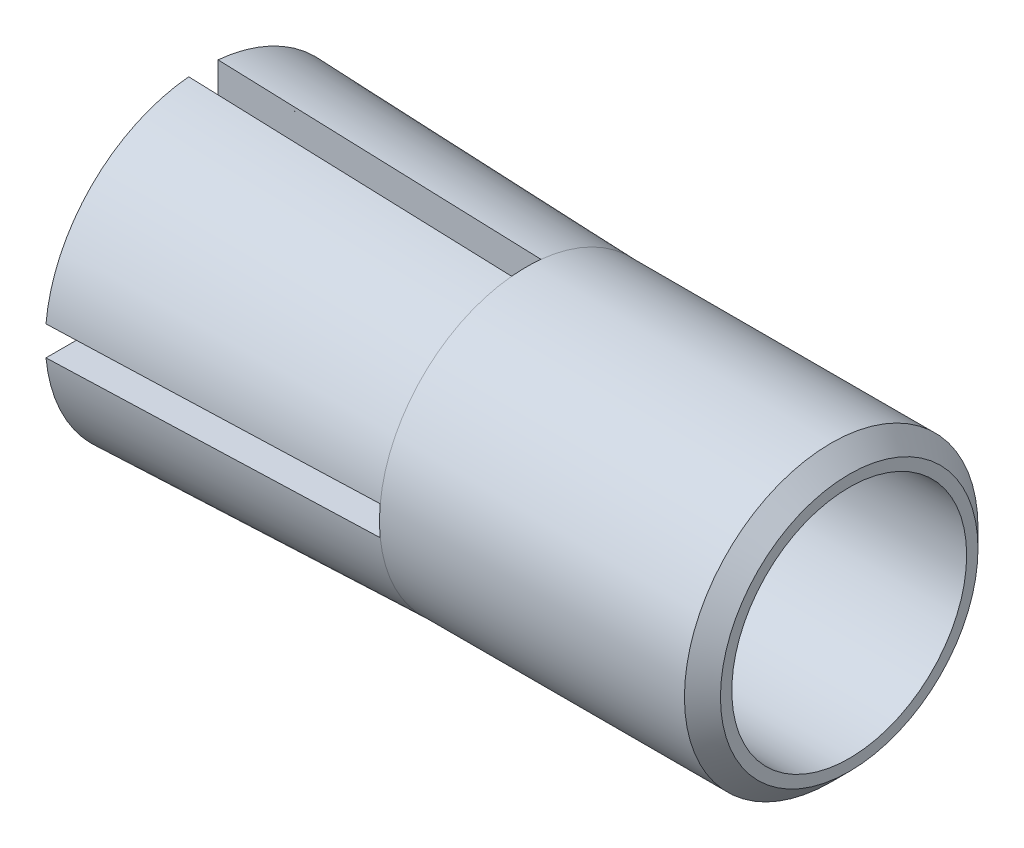
ISO-10303-21;
HEADER;
FILE_DESCRIPTION(('STEP AP214'),'2;1');
FILE_NAME('part.step','',(''),(''),'','','');
FILE_SCHEMA(('AUTOMOTIVE_DESIGN { 1 0 10303 214 1 1 1 1 }'));
ENDSEC;
DATA;
#1=APPLICATION_CONTEXT('core data for automotive mechanical design processes');
#2=APPLICATION_PROTOCOL_DEFINITION('international standard','automotive_design',2000,#1);
#3=PRODUCT_CONTEXT('',#1,'mechanical');
#4=PRODUCT('Part','Part','',(#3));
#5=PRODUCT_RELATED_PRODUCT_CATEGORY('part','',(#4));
#6=PRODUCT_DEFINITION_FORMATION('','',#4);
#7=PRODUCT_DEFINITION_CONTEXT('part definition',#1,'design');
#8=PRODUCT_DEFINITION('design','',#6,#7);
#9=PRODUCT_DEFINITION_SHAPE('','',#8);
#10=(LENGTH_UNIT() NAMED_UNIT(*) SI_UNIT(.MILLI.,.METRE.));
#11=(NAMED_UNIT(*) PLANE_ANGLE_UNIT() SI_UNIT($,.RADIAN.));
#12=(NAMED_UNIT(*) SI_UNIT($,.STERADIAN.) SOLID_ANGLE_UNIT());
#13=UNCERTAINTY_MEASURE_WITH_UNIT(LENGTH_MEASURE(1.E-05),#10,'distance_accuracy_value','');
#14=(GEOMETRIC_REPRESENTATION_CONTEXT(3) GLOBAL_UNCERTAINTY_ASSIGNED_CONTEXT((#13)) GLOBAL_UNIT_ASSIGNED_CONTEXT((#10,
#11,#12)) REPRESENTATION_CONTEXT('',''));
#15=CARTESIAN_POINT('',(0.,0.,0.));
#16=DIRECTION('',(0.,0.,1.));
#17=DIRECTION('',(1.,0.,0.));
#18=AXIS2_PLACEMENT_3D('',#15,#16,#17);
#19=CARTESIAN_POINT('',(-11.,0.,0.));
#20=DIRECTION('',(-1.,0.,0.));
#21=DIRECTION('',(0.,0.,1.));
#22=AXIS2_PLACEMENT_3D('',#19,#20,#21);
#23=CONICAL_SURFACE('',#22,5.,0.0349065850398793);
#24=CARTESIAN_POINT('',(-21.9999999999995,-5.36086180770038,-0.5));
#25=CARTESIAN_POINT('',(-20.1666659131692,-5.29656251144824,-0.5));
#26=CARTESIAN_POINT('',(-18.333332175218,-5.23225326486422,-0.5));
#27=CARTESIAN_POINT('',(-14.6666654792349,-5.10361255587181,-0.5));
#28=CARTESIAN_POINT('',(-12.8333325212559,-5.03928109580664,-0.5));
#29=CARTESIAN_POINT('',(-10.9999999999981,-4.97493718553303,-0.5));
#30=B_SPLINE_CURVE_WITH_KNOTS('',3,(#24,#25,#26,#27,#28,#29),.UNSPECIFIED.,.F.,.F.,(4,2,4),
(12.0431557356594,17.546539646234,23.0499235568085),.UNSPECIFIED.);
#31=CARTESIAN_POINT('',(-22.,-5.36086180770045,-0.5));
#32=VERTEX_POINT('',#31);
#33=CARTESIAN_POINT('',(-11.,-4.9749371855331,-0.5));
#34=VERTEX_POINT('',#33);
#35=EDGE_CURVE('E143',#32,#34,#30,.T.);
#36=ORIENTED_EDGE('',*,*,#35,.F.);
#37=CARTESIAN_POINT('',(-22.,0.,0.));
#38=DIRECTION('',(1.,0.,0.));
#39=DIRECTION('',(0.,-0.995678658697959,-0.0928655405057957));
#40=AXIS2_PLACEMENT_3D('',#37,#38,#39);
#41=CIRCLE('',#40,5.38412846440915);
#42=CARTESIAN_POINT('',(-22.,-0.5,-5.36086180770045));
#43=VERTEX_POINT('',#42);
#44=EDGE_CURVE('E132',#32,#43,#41,.T.);
#45=ORIENTED_EDGE('',*,*,#44,.T.);
#46=CARTESIAN_POINT('',(-11.0000000000055,-0.5,-4.97493718553329));
#47=CARTESIAN_POINT('',(-12.8333325215183,-0.5,-5.03928109581585));
#48=CARTESIAN_POINT('',(-14.6666654800095,-0.5,-5.10361255589899));
#49=CARTESIAN_POINT('',(-18.3333321759889,-0.5,-5.23225326489127));
#50=CARTESIAN_POINT('',(-20.1666659134242,-0.5,-5.29656251145719));
#51=CARTESIAN_POINT('',(-21.9999999999958,-0.5,-5.36086180770025));
#52=B_SPLINE_CURVE_WITH_KNOTS('',3,(#46,#47,#48,#49,#50,#51),.UNSPECIFIED.,.F.,.F.,(4,2,4),
(12.0431775500711,17.5465614611239,23.0499453721766),.UNSPECIFIED.);
#53=CARTESIAN_POINT('',(-11.,-0.5,-4.9749371855331));
#54=VERTEX_POINT('',#53);
#55=EDGE_CURVE('E142',#54,#43,#52,.T.);
#56=ORIENTED_EDGE('',*,*,#55,.F.);
#57=CARTESIAN_POINT('',(-11.,0.,0.));
#58=DIRECTION('',(1.,0.,0.));
#59=DIRECTION('',(0.,-0.99498743710662,-0.0999999999999998));
#60=AXIS2_PLACEMENT_3D('',#57,#58,#59);
#61=CIRCLE('',#60,5.);
#62=EDGE_CURVE('E157',#34,#54,#61,.T.);
#63=ORIENTED_EDGE('',*,*,#62,.F.);
#64=EDGE_LOOP('',(#36,#45,#56,#63));
#65=FACE_BOUND('',#64,.T.);
#66=ADVANCED_FACE('F16',(#65),#23,.T.);
#67=CARTESIAN_POINT('',(-11.,-0.5,-0.5));
#68=DIRECTION('',(0.,0.,-1.));
#69=DIRECTION('',(-1.,0.,0.));
#70=AXIS2_PLACEMENT_3D('',#67,#68,#69);
#71=PLANE('',#70);
#72=ORIENTED_EDGE('',*,*,#35,.T.);
#73=DIRECTION('',(0.,-1.,0.));
#74=VECTOR('',#73,1.);
#75=CARTESIAN_POINT('',(-11.,-3.96862696659689,-0.5));
#76=LINE('',#75,#74);
#77=CARTESIAN_POINT('',(-11.,-3.96862696659689,-0.5));
#78=VERTEX_POINT('',#77);
#79=EDGE_CURVE('E455',#78,#34,#76,.T.);
#80=ORIENTED_EDGE('',*,*,#79,.F.);
#81=DIRECTION('',(-1.,0.,0.));
#82=VECTOR('',#81,1.);
#83=CARTESIAN_POINT('',(-11.,-3.96862696659689,-0.5));
#84=LINE('',#83,#82);
#85=CARTESIAN_POINT('',(-22.,-3.96862696659689,-0.5));
#86=VERTEX_POINT('',#85);
#87=EDGE_CURVE('E151',#78,#86,#84,.T.);
#88=ORIENTED_EDGE('',*,*,#87,.T.);
#89=DIRECTION('',(0.,-1.,0.));
#90=VECTOR('',#89,1.);
#91=CARTESIAN_POINT('',(-22.,-3.96862696659689,-0.5));
#92=LINE('',#91,#90);
#93=EDGE_CURVE('E136',#86,#32,#92,.T.);
#94=ORIENTED_EDGE('',*,*,#93,.T.);
#95=EDGE_LOOP('',(#72,#80,#88,#94));
#96=FACE_BOUND('',#95,.T.);
#97=ADVANCED_FACE('F148',(#96),#71,.F.);
#98=CARTESIAN_POINT('',(-22.,5.3841284644092,0.));
#99=DIRECTION('',(-1.,0.,0.));
#100=DIRECTION('',(0.,0.,1.));
#101=AXIS2_PLACEMENT_3D('',#98,#99,#100);
#102=PLANE('',#101);
#103=ORIENTED_EDGE('',*,*,#93,.F.);
#104=CARTESIAN_POINT('',(-22.,0.,0.));
#105=DIRECTION('',(1.,0.,0.));
#106=DIRECTION('',(0.,-0.992156741649222,-0.125));
#107=AXIS2_PLACEMENT_3D('',#104,#105,#106);
#108=CIRCLE('',#107,4.);
#109=CARTESIAN_POINT('',(-22.,-0.5,-3.96862696659689));
#110=VERTEX_POINT('',#109);
#111=EDGE_CURVE('E152',#86,#110,#108,.T.);
#112=ORIENTED_EDGE('',*,*,#111,.T.);
#113=DIRECTION('',(0.,0.,1.));
#114=VECTOR('',#113,1.);
#115=CARTESIAN_POINT('',(-22.,-0.5,-5.36086180770045));
#116=LINE('',#115,#114);
#117=EDGE_CURVE('E138',#43,#110,#116,.T.);
#118=ORIENTED_EDGE('',*,*,#117,.F.);
#119=ORIENTED_EDGE('',*,*,#44,.F.);
#120=EDGE_LOOP('',(#103,#112,#118,#119));
#121=FACE_BOUND('',#120,.T.);
#122=ADVANCED_FACE('F134',(#121),#102,.T.);
#123=CARTESIAN_POINT('',(-11.,-0.5,-8.));
#124=DIRECTION('',(0.,-1.,0.));
#125=DIRECTION('',(0.,0.,-1.));
#126=AXIS2_PLACEMENT_3D('',#123,#124,#125);
#127=PLANE('',#126);
#128=ORIENTED_EDGE('',*,*,#55,.T.);
#129=ORIENTED_EDGE('',*,*,#117,.T.);
#130=DIRECTION('',(1.,0.,0.));
#131=VECTOR('',#130,1.);
#132=CARTESIAN_POINT('',(-22.,-0.5,-3.96862696659689));
#133=LINE('',#132,#131);
#134=CARTESIAN_POINT('',(-11.,-0.5,-3.96862696659689));
#135=VERTEX_POINT('',#134);
#136=EDGE_CURVE('E473',#110,#135,#133,.T.);
#137=ORIENTED_EDGE('',*,*,#136,.T.);
#138=DIRECTION('',(0.,0.,1.));
#139=VECTOR('',#138,1.);
#140=CARTESIAN_POINT('',(-11.,-0.5,-4.9749371855331));
#141=LINE('',#140,#139);
#142=EDGE_CURVE('E541',#54,#135,#141,.T.);
#143=ORIENTED_EDGE('',*,*,#142,.F.);
#144=EDGE_LOOP('',(#128,#129,#137,#143));
#145=FACE_BOUND('',#144,.T.);
#146=ADVANCED_FACE('F484',(#145),#127,.F.);
#147=CARTESIAN_POINT('',(10.,0.,0.));
#148=DIRECTION('',(1.,0.,0.));
#149=DIRECTION('',(0.,0.,-1.));
#150=AXIS2_PLACEMENT_3D('',#147,#148,#149);
#151=CYLINDRICAL_SURFACE('',#150,5.);
#152=CARTESIAN_POINT('',(-11.,0.,0.));
#153=DIRECTION('',(1.,0.,0.));
#154=DIRECTION('',(0.,0.1,-0.99498743710662));
#155=AXIS2_PLACEMENT_3D('',#152,#153,#154);
#156=CIRCLE('',#155,5.);
#157=CARTESIAN_POINT('',(-11.,0.5,-4.9749371855331));
#158=VERTEX_POINT('',#157);
#159=CARTESIAN_POINT('',(-11.,4.9749371855331,-0.5));
#160=VERTEX_POINT('',#159);
#161=EDGE_CURVE('E226',#158,#160,#156,.T.);
#162=ORIENTED_EDGE('',*,*,#161,.T.);
#163=CARTESIAN_POINT('',(-11.,0.,0.));
#164=DIRECTION('',(1.,0.,0.));
#165=DIRECTION('',(0.,0.99498743710662,-0.1));
#166=AXIS2_PLACEMENT_3D('',#163,#164,#165);
#167=CIRCLE('',#166,5.);
#168=CARTESIAN_POINT('',(-11.,4.9749371855331,0.5));
#169=VERTEX_POINT('',#168);
#170=EDGE_CURVE('E274',#160,#169,#167,.T.);
#171=ORIENTED_EDGE('',*,*,#170,.T.);
#172=CARTESIAN_POINT('',(-11.,0.,0.));
#173=DIRECTION('',(1.,0.,0.));
#174=DIRECTION('',(0.,0.99498743710662,0.1));
#175=AXIS2_PLACEMENT_3D('',#172,#173,#174);
#176=CIRCLE('',#175,5.);
#177=CARTESIAN_POINT('',(-11.,0.5,4.9749371855331));
#178=VERTEX_POINT('',#177);
#179=EDGE_CURVE('E259',#169,#178,#176,.T.);
#180=ORIENTED_EDGE('',*,*,#179,.T.);
#181=CARTESIAN_POINT('',(-11.,0.,0.));
#182=DIRECTION('',(1.,0.,0.));
#183=DIRECTION('',(0.,0.1,0.99498743710662));
#184=AXIS2_PLACEMENT_3D('',#181,#182,#183);
#185=CIRCLE('',#184,5.);
#186=CARTESIAN_POINT('',(-11.,-0.5,4.9749371855331));
#187=VERTEX_POINT('',#186);
#188=EDGE_CURVE('E271',#178,#187,#185,.T.);
#189=ORIENTED_EDGE('',*,*,#188,.T.);
#190=CARTESIAN_POINT('',(-11.,0.,0.));
#191=DIRECTION('',(1.,0.,0.));
#192=DIRECTION('',(0.,-0.0999999999999998,0.99498743710662));
#193=AXIS2_PLACEMENT_3D('',#190,#191,#192);
#194=CIRCLE('',#193,5.);
#195=CARTESIAN_POINT('',(-11.,-4.9749371855331,0.5));
#196=VERTEX_POINT('',#195);
#197=EDGE_CURVE('E284',#187,#196,#194,.T.);
#198=ORIENTED_EDGE('',*,*,#197,.T.);
#199=CARTESIAN_POINT('',(-11.,0.,0.));
#200=DIRECTION('',(1.,0.,0.));
#201=DIRECTION('',(0.,-0.99498743710662,0.1));
#202=AXIS2_PLACEMENT_3D('',#199,#200,#201);
#203=CIRCLE('',#202,5.);
#204=EDGE_CURVE('E286',#196,#34,#203,.T.);
#205=ORIENTED_EDGE('',*,*,#204,.T.);
#206=ORIENTED_EDGE('',*,*,#62,.T.);
#207=CARTESIAN_POINT('',(-11.,0.,0.));
#208=DIRECTION('',(1.,0.,0.));
#209=DIRECTION('',(0.,-0.1,-0.99498743710662));
#210=AXIS2_PLACEMENT_3D('',#207,#208,#209);
#211=CIRCLE('',#210,5.);
#212=EDGE_CURVE('E297',#54,#158,#211,.T.);
#213=ORIENTED_EDGE('',*,*,#212,.T.);
#214=EDGE_LOOP('',(#162,#171,#180,#189,#198,#205,#206,#213));
#215=FACE_BOUND('',#214,.T.);
#216=CARTESIAN_POINT('',(-0.6135,0.,0.));
#217=DIRECTION('',(1.,0.,0.));
#218=DIRECTION('',(0.,0.,-1.));
#219=AXIS2_PLACEMENT_3D('',#216,#217,#218);
#220=CIRCLE('',#219,5.);
#221=CARTESIAN_POINT('',(-0.6135,0.,-5.));
#222=VERTEX_POINT('',#221);
#223=EDGE_CURVE('E302',#222,#222,#220,.T.);
#224=ORIENTED_EDGE('',*,*,#223,.F.);
#225=EDGE_LOOP('',(#224));
#226=FACE_BOUND('',#225,.T.);
#227=ADVANCED_FACE('F268',(#215,#226),#151,.T.);
#228=CARTESIAN_POINT('',(-11.,0.,0.));
#229=DIRECTION('',(-1.,0.,0.));
#230=DIRECTION('',(0.,0.,1.));
#231=AXIS2_PLACEMENT_3D('',#228,#229,#230);
#232=PLANE('',#231);
#233=ORIENTED_EDGE('',*,*,#79,.T.);
#234=ORIENTED_EDGE('',*,*,#204,.F.);
#235=DIRECTION('',(0.,1.,0.));
#236=VECTOR('',#235,1.);
#237=CARTESIAN_POINT('',(-11.,-4.9749371855331,0.5));
#238=LINE('',#237,#236);
#239=CARTESIAN_POINT('',(-11.,-3.96862696659689,0.5));
#240=VERTEX_POINT('',#239);
#241=EDGE_CURVE('E307',#196,#240,#238,.T.);
#242=ORIENTED_EDGE('',*,*,#241,.T.);
#243=CARTESIAN_POINT('',(-11.,0.,0.));
#244=DIRECTION('',(-1.,0.,0.));
#245=DIRECTION('',(0.,-0.992156741649221,-0.125));
#246=AXIS2_PLACEMENT_3D('',#243,#244,#245);
#247=CIRCLE('',#246,4.);
#248=EDGE_CURVE('E310',#78,#240,#247,.T.);
#249=ORIENTED_EDGE('',*,*,#248,.F.);
#250=EDGE_LOOP('',(#233,#234,#242,#249));
#251=FACE_BOUND('',#250,.T.);
#252=ADVANCED_FACE('F453',(#251),#232,.T.);
#253=CARTESIAN_POINT('',(10.,0.,0.));
#254=DIRECTION('',(1.,0.,0.));
#255=DIRECTION('',(0.,0.,-1.));
#256=AXIS2_PLACEMENT_3D('',#253,#254,#255);
#257=CYLINDRICAL_SURFACE('',#256,4.);
#258=CARTESIAN_POINT('',(0.,0.,0.));
#259=DIRECTION('',(1.,0.,0.));
#260=DIRECTION('',(0.,0.,-1.));
#261=AXIS2_PLACEMENT_3D('',#258,#259,#260);
#262=CIRCLE('',#261,4.);
#263=CARTESIAN_POINT('',(0.,0.,-4.));
#264=VERTEX_POINT('',#263);
#265=EDGE_CURVE('E315',#264,#264,#262,.T.);
#266=ORIENTED_EDGE('',*,*,#265,.T.);
#267=EDGE_LOOP('',(#266));
#268=FACE_BOUND('',#267,.T.);
#269=DIRECTION('',(-1.,0.,0.));
#270=VECTOR('',#269,1.);
#271=CARTESIAN_POINT('',(-11.,3.96862696659689,0.5));
#272=LINE('',#271,#270);
#273=CARTESIAN_POINT('',(-11.,3.96862696659689,0.5));
#274=VERTEX_POINT('',#273);
#275=CARTESIAN_POINT('',(-22.,3.96862696659689,0.5));
#276=VERTEX_POINT('',#275);
#277=EDGE_CURVE('E320',#274,#276,#272,.T.);
#278=ORIENTED_EDGE('',*,*,#277,.F.);
#279=CARTESIAN_POINT('',(-11.,0.,0.));
#280=DIRECTION('',(-1.,0.,0.));
#281=DIRECTION('',(0.,0.992156741649222,0.125));
#282=AXIS2_PLACEMENT_3D('',#279,#280,#281);
#283=CIRCLE('',#282,4.);
#284=CARTESIAN_POINT('',(-11.,3.96862696659689,-0.5));
#285=VERTEX_POINT('',#284);
#286=EDGE_CURVE('E323',#274,#285,#283,.T.);
#287=ORIENTED_EDGE('',*,*,#286,.T.);
#288=DIRECTION('',(1.,0.,0.));
#289=VECTOR('',#288,1.);
#290=CARTESIAN_POINT('',(-22.,3.96862696659689,-0.5));
#291=LINE('',#290,#289);
#292=CARTESIAN_POINT('',(-22.,3.96862696659689,-0.5));
#293=VERTEX_POINT('',#292);
#294=EDGE_CURVE('E328',#293,#285,#291,.T.);
#295=ORIENTED_EDGE('',*,*,#294,.F.);
#296=CARTESIAN_POINT('',(-22.,0.,0.));
#297=DIRECTION('',(1.,0.,0.));
#298=DIRECTION('',(0.,0.125,-0.992156741649222));
#299=AXIS2_PLACEMENT_3D('',#296,#297,#298);
#300=CIRCLE('',#299,4.);
#301=CARTESIAN_POINT('',(-22.,0.5,-3.96862696659689));
#302=VERTEX_POINT('',#301);
#303=EDGE_CURVE('E332',#302,#293,#300,.T.);
#304=ORIENTED_EDGE('',*,*,#303,.F.);
#305=DIRECTION('',(-1.,0.,0.));
#306=VECTOR('',#305,1.);
#307=CARTESIAN_POINT('',(-11.,0.5,-3.96862696659689));
#308=LINE('',#307,#306);
#309=CARTESIAN_POINT('',(-11.,0.5,-3.96862696659689));
#310=VERTEX_POINT('',#309);
#311=EDGE_CURVE('E336',#310,#302,#308,.T.);
#312=ORIENTED_EDGE('',*,*,#311,.F.);
#313=CARTESIAN_POINT('',(-11.,0.,0.));
#314=DIRECTION('',(-1.,0.,0.));
#315=DIRECTION('',(0.,0.125,-0.992156741649222));
#316=AXIS2_PLACEMENT_3D('',#313,#314,#315);
#317=CIRCLE('',#316,4.);
#318=EDGE_CURVE('E340',#310,#135,#317,.T.);
#319=ORIENTED_EDGE('',*,*,#318,.T.);
#320=ORIENTED_EDGE('',*,*,#136,.F.);
#321=ORIENTED_EDGE('',*,*,#111,.F.);
#322=ORIENTED_EDGE('',*,*,#87,.F.);
#323=ORIENTED_EDGE('',*,*,#248,.T.);
#324=DIRECTION('',(1.,0.,0.));
#325=VECTOR('',#324,1.);
#326=CARTESIAN_POINT('',(-22.,-3.96862696659689,0.5));
#327=LINE('',#326,#325);
#328=CARTESIAN_POINT('',(-22.,-3.96862696659689,0.5));
#329=VERTEX_POINT('',#328);
#330=EDGE_CURVE('E345',#329,#240,#327,.T.);
#331=ORIENTED_EDGE('',*,*,#330,.F.);
#332=CARTESIAN_POINT('',(-22.,0.,0.));
#333=DIRECTION('',(1.,0.,0.));
#334=DIRECTION('',(0.,-0.125,0.992156741649222));
#335=AXIS2_PLACEMENT_3D('',#332,#333,#334);
#336=CIRCLE('',#335,4.);
#337=CARTESIAN_POINT('',(-22.,-0.5,3.96862696659689));
#338=VERTEX_POINT('',#337);
#339=EDGE_CURVE('E349',#338,#329,#336,.T.);
#340=ORIENTED_EDGE('',*,*,#339,.F.);
#341=DIRECTION('',(-1.,0.,0.));
#342=VECTOR('',#341,1.);
#343=CARTESIAN_POINT('',(-11.,-0.5,3.96862696659689));
#344=LINE('',#343,#342);
#345=CARTESIAN_POINT('',(-11.,-0.5,3.96862696659689));
#346=VERTEX_POINT('',#345);
#347=EDGE_CURVE('E353',#346,#338,#344,.T.);
#348=ORIENTED_EDGE('',*,*,#347,.F.);
#349=CARTESIAN_POINT('',(-11.,0.,0.));
#350=DIRECTION('',(-1.,0.,0.));
#351=DIRECTION('',(0.,-0.125,0.992156741649221));
#352=AXIS2_PLACEMENT_3D('',#349,#350,#351);
#353=CIRCLE('',#352,4.);
#354=CARTESIAN_POINT('',(-11.,0.5,3.96862696659689));
#355=VERTEX_POINT('',#354);
#356=EDGE_CURVE('E357',#346,#355,#353,.T.);
#357=ORIENTED_EDGE('',*,*,#356,.T.);
#358=DIRECTION('',(1.,0.,0.));
#359=VECTOR('',#358,1.);
#360=CARTESIAN_POINT('',(-22.,0.5,3.96862696659689));
#361=LINE('',#360,#359);
#362=CARTESIAN_POINT('',(-22.,0.5,3.96862696659689));
#363=VERTEX_POINT('',#362);
#364=EDGE_CURVE('E361',#363,#355,#361,.T.);
#365=ORIENTED_EDGE('',*,*,#364,.F.);
#366=CARTESIAN_POINT('',(-22.,0.,0.));
#367=DIRECTION('',(1.,0.,0.));
#368=DIRECTION('',(0.,0.992156741649222,0.125));
#369=AXIS2_PLACEMENT_3D('',#366,#367,#368);
#370=CIRCLE('',#369,4.);
#371=EDGE_CURVE('E365',#276,#363,#370,.T.);
#372=ORIENTED_EDGE('',*,*,#371,.F.);
#373=EDGE_LOOP('',(#278,#287,#295,#304,#312,#319,#320,#321,#322,#323,#331,#340,#348,#357,#365,#372));
#374=FACE_BOUND('',#373,.T.);
#375=ADVANCED_FACE('F497',(#268,#374),#257,.F.);
#376=DIRECTION('',(0.,0.,-1.));
#377=VECTOR('',#376,1.);
#378=CARTESIAN_POINT('',(-11.,0.5,-3.96862696659689));
#379=LINE('',#378,#377);
#380=EDGE_CURVE('E369',#310,#158,#379,.T.);
#381=ORIENTED_EDGE('',*,*,#380,.T.);
#382=ORIENTED_EDGE('',*,*,#212,.F.);
#383=ORIENTED_EDGE('',*,*,#142,.T.);
#384=ORIENTED_EDGE('',*,*,#318,.F.);
#385=EDGE_LOOP('',(#381,#382,#383,#384));
#386=FACE_BOUND('',#385,.T.);
#387=ADVANCED_FACE('F498',(#386),#232,.T.);
#388=CARTESIAN_POINT('',(-11.0000000000055,4.97493718553329,-0.5));
#389=CARTESIAN_POINT('',(-12.8333325215183,5.03928109581585,-0.5));
#390=CARTESIAN_POINT('',(-14.6666654800095,5.10361255589899,-0.5));
#391=CARTESIAN_POINT('',(-18.3333321759889,5.23225326489127,-0.5));
#392=CARTESIAN_POINT('',(-20.1666659134242,5.29656251145719,-0.5));
#393=CARTESIAN_POINT('',(-21.9999999999958,5.36086180770025,-0.5));
#394=B_SPLINE_CURVE_WITH_KNOTS('',3,(#388,#389,#390,#391,#392,#393),.UNSPECIFIED.,.F.,.F.,(4,2,
4),(12.0431775500711,17.5465614611239,23.0499453721766),.UNSPECIFIED.);
#395=CARTESIAN_POINT('',(-22.,5.36086180770045,-0.5));
#396=VERTEX_POINT('',#395);
#397=EDGE_CURVE('E230',#160,#396,#394,.T.);
#398=ORIENTED_EDGE('',*,*,#397,.F.);
#399=ORIENTED_EDGE('',*,*,#161,.F.);
#400=CARTESIAN_POINT('',(-21.9999999999995,0.5,-5.36086180770038));
#401=CARTESIAN_POINT('',(-20.1666659131692,0.5,-5.29656251144824));
#402=CARTESIAN_POINT('',(-18.333332175218,0.5,-5.23225326486422));
#403=CARTESIAN_POINT('',(-14.6666654792349,0.5,-5.10361255587181));
#404=CARTESIAN_POINT('',(-12.8333325212559,0.5,-5.03928109580664));
#405=CARTESIAN_POINT('',(-10.9999999999981,0.5,-4.97493718553303));
#406=B_SPLINE_CURVE_WITH_KNOTS('',3,(#400,#401,#402,#403,#404,#405),.UNSPECIFIED.,.F.,.F.,(4,2,
4),(12.0431557356594,17.546539646234,23.0499235568085),.UNSPECIFIED.);
#407=CARTESIAN_POINT('',(-22.,0.5,-5.36086180770045));
#408=VERTEX_POINT('',#407);
#409=EDGE_CURVE('E221',#408,#158,#406,.T.);
#410=ORIENTED_EDGE('',*,*,#409,.F.);
#411=CARTESIAN_POINT('',(-22.,0.,0.));
#412=DIRECTION('',(1.,0.,0.));
#413=DIRECTION('',(0.,0.0928655405057957,-0.995678658697959));
#414=AXIS2_PLACEMENT_3D('',#411,#412,#413);
#415=CIRCLE('',#414,5.38412846440915);
#416=EDGE_CURVE('E223',#408,#396,#415,.T.);
#417=ORIENTED_EDGE('',*,*,#416,.T.);
#418=EDGE_LOOP('',(#398,#399,#410,#417));
#419=FACE_BOUND('',#418,.T.);
#420=ADVANCED_FACE('F172',(#419),#23,.T.);
#421=DIRECTION('',(0.,1.,0.));
#422=VECTOR('',#421,1.);
#423=CARTESIAN_POINT('',(-11.,3.96862696659689,0.5));
#424=LINE('',#423,#422);
#425=EDGE_CURVE('E238',#274,#169,#424,.T.);
#426=ORIENTED_EDGE('',*,*,#425,.T.);
#427=ORIENTED_EDGE('',*,*,#170,.F.);
#428=DIRECTION('',(0.,-1.,0.));
#429=VECTOR('',#428,1.);
#430=CARTESIAN_POINT('',(-11.,4.9749371855331,-0.5));
#431=LINE('',#430,#429);
#432=EDGE_CURVE('E240',#160,#285,#431,.T.);
#433=ORIENTED_EDGE('',*,*,#432,.T.);
#434=ORIENTED_EDGE('',*,*,#286,.F.);
#435=EDGE_LOOP('',(#426,#427,#433,#434));
#436=FACE_BOUND('',#435,.T.);
#437=ADVANCED_FACE('F634',(#436),#232,.T.);
#438=CARTESIAN_POINT('',(-11.0000000000055,0.5,4.97493718553329));
#439=CARTESIAN_POINT('',(-12.8333325215183,0.5,5.03928109581585));
#440=CARTESIAN_POINT('',(-14.6666654800095,0.5,5.10361255589899));
#441=CARTESIAN_POINT('',(-18.3333321759889,0.5,5.23225326489127));
#442=CARTESIAN_POINT('',(-20.1666659134242,0.5,5.29656251145719));
#443=CARTESIAN_POINT('',(-21.9999999999958,0.5,5.36086180770025));
#444=B_SPLINE_CURVE_WITH_KNOTS('',3,(#438,#439,#440,#441,#442,#443),.UNSPECIFIED.,.F.,.F.,(4,2,
4),(12.0431775500711,17.5465614611239,23.0499453721766),.UNSPECIFIED.);
#445=CARTESIAN_POINT('',(-22.,0.5,5.36086180770045));
#446=VERTEX_POINT('',#445);
#447=EDGE_CURVE('E249',#178,#446,#444,.T.);
#448=ORIENTED_EDGE('',*,*,#447,.F.);
#449=ORIENTED_EDGE('',*,*,#179,.F.);
#450=CARTESIAN_POINT('',(-21.9999999999995,5.36086180770038,0.5));
#451=CARTESIAN_POINT('',(-20.1666659131692,5.29656251144824,0.5));
#452=CARTESIAN_POINT('',(-18.333332175218,5.23225326486422,0.5));
#453=CARTESIAN_POINT('',(-14.6666654792349,5.10361255587181,0.5));
#454=CARTESIAN_POINT('',(-12.8333325212559,5.03928109580664,0.5));
#455=CARTESIAN_POINT('',(-10.9999999999981,4.97493718553303,0.5));
#456=B_SPLINE_CURVE_WITH_KNOTS('',3,(#450,#451,#452,#453,#454,#455),.UNSPECIFIED.,.F.,.F.,(4,2,
4),(12.0431557356594,17.546539646234,23.0499235568085),.UNSPECIFIED.);
#457=CARTESIAN_POINT('',(-22.,5.36086180770045,0.5));
#458=VERTEX_POINT('',#457);
#459=EDGE_CURVE('E263',#458,#169,#456,.T.);
#460=ORIENTED_EDGE('',*,*,#459,.F.);
#461=CARTESIAN_POINT('',(-22.,0.,0.));
#462=DIRECTION('',(1.,0.,0.));
#463=DIRECTION('',(0.,0.995678658697959,0.0928655405057959));
#464=AXIS2_PLACEMENT_3D('',#461,#462,#463);
#465=CIRCLE('',#464,5.38412846440915);
#466=EDGE_CURVE('E260',#458,#446,#465,.T.);
#467=ORIENTED_EDGE('',*,*,#466,.T.);
#468=EDGE_LOOP('',(#448,#449,#460,#467));
#469=FACE_BOUND('',#468,.T.);
#470=ADVANCED_FACE('F257',(#469),#23,.T.);
#471=DIRECTION('',(0.,0.,1.));
#472=VECTOR('',#471,1.);
#473=CARTESIAN_POINT('',(-11.,-0.5,3.96862696659689));
#474=LINE('',#473,#472);
#475=EDGE_CURVE('E283',#346,#187,#474,.T.);
#476=ORIENTED_EDGE('',*,*,#475,.T.);
#477=ORIENTED_EDGE('',*,*,#188,.F.);
#478=DIRECTION('',(0.,0.,-1.));
#479=VECTOR('',#478,1.);
#480=CARTESIAN_POINT('',(-11.,0.5,4.9749371855331));
#481=LINE('',#480,#479);
#482=EDGE_CURVE('E281',#178,#355,#481,.T.);
#483=ORIENTED_EDGE('',*,*,#482,.T.);
#484=ORIENTED_EDGE('',*,*,#356,.F.);
#485=EDGE_LOOP('',(#476,#477,#483,#484));
#486=FACE_BOUND('',#485,.T.);
#487=ADVANCED_FACE('F279',(#486),#232,.T.);
#488=CARTESIAN_POINT('',(-11.0000000000055,-4.97493718553329,0.5));
#489=CARTESIAN_POINT('',(-12.8333325215183,-5.03928109581585,0.5));
#490=CARTESIAN_POINT('',(-14.6666654800095,-5.10361255589899,0.5));
#491=CARTESIAN_POINT('',(-18.3333321759889,-5.23225326489127,0.5));
#492=CARTESIAN_POINT('',(-20.1666659134242,-5.29656251145719,0.5));
#493=CARTESIAN_POINT('',(-21.9999999999958,-5.36086180770025,0.5));
#494=B_SPLINE_CURVE_WITH_KNOTS('',3,(#488,#489,#490,#491,#492,#493),.UNSPECIFIED.,.F.,.F.,(4,2,
4),(12.0431775500711,17.5465614611239,23.0499453721766),.UNSPECIFIED.);
#495=CARTESIAN_POINT('',(-22.,-5.36086180770045,0.5));
#496=VERTEX_POINT('',#495);
#497=EDGE_CURVE('E439',#196,#496,#494,.T.);
#498=ORIENTED_EDGE('',*,*,#497,.F.);
#499=ORIENTED_EDGE('',*,*,#197,.F.);
#500=CARTESIAN_POINT('',(-21.9999999999995,-0.5,5.36086180770038));
#501=CARTESIAN_POINT('',(-20.1666659131692,-0.5,5.29656251144824));
#502=CARTESIAN_POINT('',(-18.333332175218,-0.5,5.23225326486422));
#503=CARTESIAN_POINT('',(-14.6666654792349,-0.5,5.10361255587181));
#504=CARTESIAN_POINT('',(-12.8333325212559,-0.5,5.03928109580664));
#505=CARTESIAN_POINT('',(-10.9999999999981,-0.5,4.97493718553303));
#506=B_SPLINE_CURVE_WITH_KNOTS('',3,(#500,#501,#502,#503,#504,#505),.UNSPECIFIED.,.F.,.F.,(4,2,
4),(12.0431557356594,17.546539646234,23.0499235568085),.UNSPECIFIED.);
#507=CARTESIAN_POINT('',(-22.,-0.5,5.36086180770045));
#508=VERTEX_POINT('',#507);
#509=EDGE_CURVE('E420',#508,#187,#506,.T.);
#510=ORIENTED_EDGE('',*,*,#509,.F.);
#511=CARTESIAN_POINT('',(-22.,0.,0.));
#512=DIRECTION('',(1.,0.,0.));
#513=DIRECTION('',(0.,-0.0928655405057958,0.995678658697959));
#514=AXIS2_PLACEMENT_3D('',#511,#512,#513);
#515=CIRCLE('',#514,5.38412846440915);
#516=EDGE_CURVE('E438',#508,#496,#515,.T.);
#517=ORIENTED_EDGE('',*,*,#516,.T.);
#518=EDGE_LOOP('',(#498,#499,#510,#517));
#519=FACE_BOUND('',#518,.T.);
#520=ADVANCED_FACE('F171',(#519),#23,.T.);
#521=CARTESIAN_POINT('',(0.,0.,0.));
#522=DIRECTION('',(-1.,0.,0.));
#523=DIRECTION('',(0.,0.,1.));
#524=AXIS2_PLACEMENT_3D('',#521,#522,#523);
#525=CONICAL_SURFACE('',#524,4.3865,0.785398163397449);
#526=ORIENTED_EDGE('',*,*,#223,.T.);
#527=EDGE_LOOP('',(#526));
#528=FACE_BOUND('',#527,.T.);
#529=CARTESIAN_POINT('',(0.,0.,0.));
#530=DIRECTION('',(1.,0.,0.));
#531=DIRECTION('',(0.,0.,-1.));
#532=AXIS2_PLACEMENT_3D('',#529,#530,#531);
#533=CIRCLE('',#532,4.3865);
#534=CARTESIAN_POINT('',(0.,0.,-4.3865));
#535=VERTEX_POINT('',#534);
#536=EDGE_CURVE('E440',#535,#535,#533,.T.);
#537=ORIENTED_EDGE('',*,*,#536,.F.);
#538=EDGE_LOOP('',(#537));
#539=FACE_BOUND('',#538,.T.);
#540=ADVANCED_FACE('F502',(#528,#539),#525,.T.);
#541=CARTESIAN_POINT('',(-11.,-8.,0.5));
#542=DIRECTION('',(0.,0.,1.));
#543=DIRECTION('',(1.,0.,0.));
#544=AXIS2_PLACEMENT_3D('',#541,#542,#543);
#545=PLANE('',#544);
#546=ORIENTED_EDGE('',*,*,#497,.T.);
#547=DIRECTION('',(0.,1.,0.));
#548=VECTOR('',#547,1.);
#549=CARTESIAN_POINT('',(-22.,-5.36086180770045,0.5));
#550=LINE('',#549,#548);
#551=EDGE_CURVE('E33',#496,#329,#550,.T.);
#552=ORIENTED_EDGE('',*,*,#551,.T.);
#553=ORIENTED_EDGE('',*,*,#330,.T.);
#554=ORIENTED_EDGE('',*,*,#241,.F.);
#555=EDGE_LOOP('',(#546,#552,#553,#554));
#556=FACE_BOUND('',#555,.T.);
#557=ADVANCED_FACE('F505',(#556),#545,.F.);
#558=CARTESIAN_POINT('',(0.,4.,0.));
#559=DIRECTION('',(1.,0.,0.));
#560=DIRECTION('',(0.,0.,-1.));
#561=AXIS2_PLACEMENT_3D('',#558,#559,#560);
#562=PLANE('',#561);
#563=ORIENTED_EDGE('',*,*,#536,.T.);
#564=EDGE_LOOP('',(#563));
#565=FACE_BOUND('',#564,.T.);
#566=ORIENTED_EDGE('',*,*,#265,.F.);
#567=EDGE_LOOP('',(#566));
#568=FACE_BOUND('',#567,.T.);
#569=ADVANCED_FACE('F509',(#565,#568),#562,.T.);
#570=CARTESIAN_POINT('',(-11.,0.5,0.5));
#571=DIRECTION('',(0.,0.,1.));
#572=DIRECTION('',(1.,0.,0.));
#573=AXIS2_PLACEMENT_3D('',#570,#571,#572);
#574=PLANE('',#573);
#575=ORIENTED_EDGE('',*,*,#459,.T.);
#576=ORIENTED_EDGE('',*,*,#425,.F.);
#577=ORIENTED_EDGE('',*,*,#277,.T.);
#578=DIRECTION('',(0.,1.,0.));
#579=VECTOR('',#578,1.);
#580=CARTESIAN_POINT('',(-22.,3.96862696659689,0.5));
#581=LINE('',#580,#579);
#582=EDGE_CURVE('E521',#276,#458,#581,.T.);
#583=ORIENTED_EDGE('',*,*,#582,.T.);
#584=EDGE_LOOP('',(#575,#576,#577,#583));
#585=FACE_BOUND('',#584,.T.);
#586=ADVANCED_FACE('F397',(#585),#574,.F.);
#587=CARTESIAN_POINT('',(-11.,8.,-0.5));
#588=DIRECTION('',(0.,0.,-1.));
#589=DIRECTION('',(-1.,0.,0.));
#590=AXIS2_PLACEMENT_3D('',#587,#588,#589);
#591=PLANE('',#590);
#592=ORIENTED_EDGE('',*,*,#397,.T.);
#593=DIRECTION('',(0.,-1.,0.));
#594=VECTOR('',#593,1.);
#595=CARTESIAN_POINT('',(-22.,5.36086180770045,-0.5));
#596=LINE('',#595,#594);
#597=EDGE_CURVE('E237',#396,#293,#596,.T.);
#598=ORIENTED_EDGE('',*,*,#597,.T.);
#599=ORIENTED_EDGE('',*,*,#294,.T.);
#600=ORIENTED_EDGE('',*,*,#432,.F.);
#601=EDGE_LOOP('',(#592,#598,#599,#600));
#602=FACE_BOUND('',#601,.T.);
#603=ADVANCED_FACE('F377',(#602),#591,.F.);
#604=ORIENTED_EDGE('',*,*,#597,.F.);
#605=ORIENTED_EDGE('',*,*,#416,.F.);
#606=DIRECTION('',(0.,0.,-1.));
#607=VECTOR('',#606,1.);
#608=CARTESIAN_POINT('',(-22.,0.5,-3.96862696659689));
#609=LINE('',#608,#607);
#610=EDGE_CURVE('E234',#302,#408,#609,.T.);
#611=ORIENTED_EDGE('',*,*,#610,.F.);
#612=ORIENTED_EDGE('',*,*,#303,.T.);
#613=EDGE_LOOP('',(#604,#605,#611,#612));
#614=FACE_BOUND('',#613,.T.);
#615=ADVANCED_FACE('F233',(#614),#102,.T.);
#616=CARTESIAN_POINT('',(-11.,0.5,-0.5));
#617=DIRECTION('',(0.,1.,0.));
#618=DIRECTION('',(0.,0.,1.));
#619=AXIS2_PLACEMENT_3D('',#616,#617,#618);
#620=PLANE('',#619);
#621=ORIENTED_EDGE('',*,*,#409,.T.);
#622=ORIENTED_EDGE('',*,*,#380,.F.);
#623=ORIENTED_EDGE('',*,*,#311,.T.);
#624=ORIENTED_EDGE('',*,*,#610,.T.);
#625=EDGE_LOOP('',(#621,#622,#623,#624));
#626=FACE_BOUND('',#625,.T.);
#627=ADVANCED_FACE('F400',(#626),#620,.F.);
#628=ORIENTED_EDGE('',*,*,#551,.F.);
#629=ORIENTED_EDGE('',*,*,#516,.F.);
#630=DIRECTION('',(0.,0.,1.));
#631=VECTOR('',#630,1.);
#632=CARTESIAN_POINT('',(-22.,-0.5,3.96862696659689));
#633=LINE('',#632,#631);
#634=EDGE_CURVE('E26',#338,#508,#633,.T.);
#635=ORIENTED_EDGE('',*,*,#634,.F.);
#636=ORIENTED_EDGE('',*,*,#339,.T.);
#637=EDGE_LOOP('',(#628,#629,#635,#636));
#638=FACE_BOUND('',#637,.T.);
#639=ADVANCED_FACE('F403',(#638),#102,.T.);
#640=CARTESIAN_POINT('',(-11.,-0.5,0.5));
#641=DIRECTION('',(0.,-1.,0.));
#642=DIRECTION('',(0.,0.,-1.));
#643=AXIS2_PLACEMENT_3D('',#640,#641,#642);
#644=PLANE('',#643);
#645=ORIENTED_EDGE('',*,*,#509,.T.);
#646=ORIENTED_EDGE('',*,*,#475,.F.);
#647=ORIENTED_EDGE('',*,*,#347,.T.);
#648=ORIENTED_EDGE('',*,*,#634,.T.);
#649=EDGE_LOOP('',(#645,#646,#647,#648));
#650=FACE_BOUND('',#649,.T.);
#651=ADVANCED_FACE('F404',(#650),#644,.F.);
#652=CARTESIAN_POINT('',(-11.,0.5,8.));
#653=DIRECTION('',(0.,1.,0.));
#654=DIRECTION('',(0.,0.,1.));
#655=AXIS2_PLACEMENT_3D('',#652,#653,#654);
#656=PLANE('',#655);
#657=ORIENTED_EDGE('',*,*,#447,.T.);
#658=DIRECTION('',(0.,0.,-1.));
#659=VECTOR('',#658,1.);
#660=CARTESIAN_POINT('',(-22.,0.5,5.36086180770045));
#661=LINE('',#660,#659);
#662=EDGE_CURVE('E10',#446,#363,#661,.T.);
#663=ORIENTED_EDGE('',*,*,#662,.T.);
#664=ORIENTED_EDGE('',*,*,#364,.T.);
#665=ORIENTED_EDGE('',*,*,#482,.F.);
#666=EDGE_LOOP('',(#657,#663,#664,#665));
#667=FACE_BOUND('',#666,.T.);
#668=ADVANCED_FACE('F18',(#667),#656,.F.);
#669=ORIENTED_EDGE('',*,*,#662,.F.);
#670=ORIENTED_EDGE('',*,*,#466,.F.);
#671=ORIENTED_EDGE('',*,*,#582,.F.);
#672=ORIENTED_EDGE('',*,*,#371,.T.);
#673=EDGE_LOOP('',(#669,#670,#671,#672));
#674=FACE_BOUND('',#673,.T.);
#675=ADVANCED_FACE('F555',(#674),#102,.T.);
#676=CLOSED_SHELL('',(#66,#97,#122,#146,#227,#252,#375,#387,#420,#437,#470,#487,#520,#540,#557,
#569,#586,#603,#615,#627,#639,#651,#668,#675));
#677=MANIFOLD_SOLID_BREP('B1',#676);
#678=ADVANCED_BREP_SHAPE_REPRESENTATION('',(#18,#677),#14);
#679=SHAPE_DEFINITION_REPRESENTATION(#9,#678);
ENDSEC;
END-ISO-10303-21;
